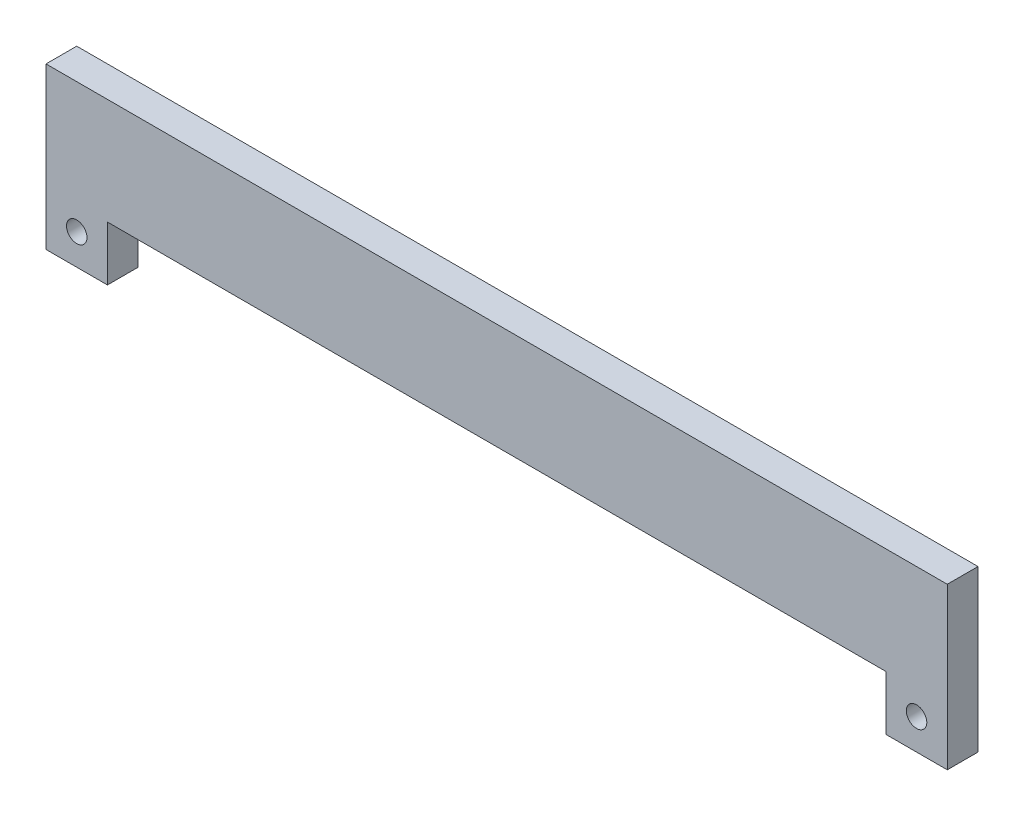
ISO-10303-21;
HEADER;
FILE_DESCRIPTION(('STEP AP214'),'2;1');
FILE_NAME('part.step','',(''),(''),'','','');
FILE_SCHEMA(('AUTOMOTIVE_DESIGN { 1 0 10303 214 1 1 1 1 }'));
ENDSEC;
DATA;
#1=APPLICATION_CONTEXT('core data for automotive mechanical design processes');
#2=APPLICATION_PROTOCOL_DEFINITION('international standard','automotive_design',2000,#1);
#3=PRODUCT_CONTEXT('',#1,'mechanical');
#4=PRODUCT('Part','Part','',(#3));
#5=PRODUCT_RELATED_PRODUCT_CATEGORY('part','',(#4));
#6=PRODUCT_DEFINITION_FORMATION('','',#4);
#7=PRODUCT_DEFINITION_CONTEXT('part definition',#1,'design');
#8=PRODUCT_DEFINITION('design','',#6,#7);
#9=PRODUCT_DEFINITION_SHAPE('','',#8);
#10=(LENGTH_UNIT() NAMED_UNIT(*) SI_UNIT(.MILLI.,.METRE.));
#11=(NAMED_UNIT(*) PLANE_ANGLE_UNIT() SI_UNIT($,.RADIAN.));
#12=(NAMED_UNIT(*) SI_UNIT($,.STERADIAN.) SOLID_ANGLE_UNIT());
#13=UNCERTAINTY_MEASURE_WITH_UNIT(LENGTH_MEASURE(1.E-05),#10,'distance_accuracy_value','');
#14=(GEOMETRIC_REPRESENTATION_CONTEXT(3) GLOBAL_UNCERTAINTY_ASSIGNED_CONTEXT((#13)) GLOBAL_UNIT_ASSIGNED_CONTEXT((#10,
#11,#12)) REPRESENTATION_CONTEXT('',''));
#15=CARTESIAN_POINT('',(0.,0.,0.));
#16=DIRECTION('',(0.,0.,1.));
#17=DIRECTION('',(1.,0.,0.));
#18=AXIS2_PLACEMENT_3D('',#15,#16,#17);
#19=CARTESIAN_POINT('',(-241.3,0.,19.05));
#20=DIRECTION('',(1.,0.,0.));
#21=DIRECTION('',(0.,0.,-1.));
#22=AXIS2_PLACEMENT_3D('',#19,#20,#21);
#23=PLANE('',#22);
#24=DIRECTION('',(0.,-1.,0.));
#25=VECTOR('',#24,1.);
#26=CARTESIAN_POINT('',(-241.3,0.,0.));
#27=LINE('',#26,#25);
#28=CARTESIAN_POINT('',(-241.3,-25.755,0.));
#29=VERTEX_POINT('',#28);
#30=CARTESIAN_POINT('',(-241.3,-59.55,0.));
#31=VERTEX_POINT('',#30);
#32=EDGE_CURVE('E136',#29,#31,#27,.T.);
#33=ORIENTED_EDGE('',*,*,#32,.F.);
#34=DIRECTION('',(0.,0.,-1.));
#35=VECTOR('',#34,1.);
#36=CARTESIAN_POINT('',(-241.3,-25.755,19.05));
#37=LINE('',#36,#35);
#38=CARTESIAN_POINT('',(-241.3,-25.755,19.05));
#39=VERTEX_POINT('',#38);
#40=EDGE_CURVE('E11',#39,#29,#37,.T.);
#41=ORIENTED_EDGE('',*,*,#40,.F.);
#42=DIRECTION('',(0.,-1.,0.));
#43=VECTOR('',#42,1.);
#44=CARTESIAN_POINT('',(-241.3,0.,19.05));
#45=LINE('',#44,#43);
#46=CARTESIAN_POINT('',(-241.3,-59.55,19.05));
#47=VERTEX_POINT('',#46);
#48=EDGE_CURVE('E158',#39,#47,#45,.T.);
#49=ORIENTED_EDGE('',*,*,#48,.T.);
#50=DIRECTION('',(0.,0.,-1.));
#51=VECTOR('',#50,1.);
#52=CARTESIAN_POINT('',(-241.3,-59.55,19.05));
#53=LINE('',#52,#51);
#54=EDGE_CURVE('E51',#47,#31,#53,.T.);
#55=ORIENTED_EDGE('',*,*,#54,.T.);
#56=EDGE_LOOP('',(#33,#41,#49,#55));
#57=FACE_BOUND('',#56,.T.);
#58=ADVANCED_FACE('F35',(#57),#23,.T.);
#59=CARTESIAN_POINT('',(0.,-25.755,19.05));
#60=DIRECTION('',(0.,1.,0.));
#61=DIRECTION('',(-1.,0.,0.));
#62=AXIS2_PLACEMENT_3D('',#59,#60,#61);
#63=PLANE('',#62);
#64=DIRECTION('',(1.,0.,0.));
#65=VECTOR('',#64,1.);
#66=CARTESIAN_POINT('',(0.,-25.755,0.));
#67=LINE('',#66,#65);
#68=CARTESIAN_POINT('',(241.3,-25.755,0.));
#69=VERTEX_POINT('',#68);
#70=EDGE_CURVE('E138',#29,#69,#67,.T.);
#71=ORIENTED_EDGE('',*,*,#70,.T.);
#72=DIRECTION('',(0.,0.,-1.));
#73=VECTOR('',#72,1.);
#74=CARTESIAN_POINT('',(241.3,-25.755,19.05));
#75=LINE('',#74,#73);
#76=CARTESIAN_POINT('',(241.3,-25.755,19.05));
#77=VERTEX_POINT('',#76);
#78=EDGE_CURVE('E43',#77,#69,#75,.T.);
#79=ORIENTED_EDGE('',*,*,#78,.F.);
#80=DIRECTION('',(1.,0.,0.));
#81=VECTOR('',#80,1.);
#82=CARTESIAN_POINT('',(0.,-25.755,19.05));
#83=LINE('',#82,#81);
#84=EDGE_CURVE('E192',#39,#77,#83,.T.);
#85=ORIENTED_EDGE('',*,*,#84,.F.);
#86=ORIENTED_EDGE('',*,*,#40,.T.);
#87=EDGE_LOOP('',(#71,#79,#85,#86));
#88=FACE_BOUND('',#87,.T.);
#89=ADVANCED_FACE('F209',(#88),#63,.F.);
#90=CARTESIAN_POINT('',(241.3,0.,19.05));
#91=DIRECTION('',(1.,0.,0.));
#92=DIRECTION('',(0.,0.,-1.));
#93=AXIS2_PLACEMENT_3D('',#90,#91,#92);
#94=PLANE('',#93);
#95=DIRECTION('',(0.,-1.,0.));
#96=VECTOR('',#95,1.);
#97=CARTESIAN_POINT('',(241.3,0.,0.));
#98=LINE('',#97,#96);
#99=CARTESIAN_POINT('',(241.3,-59.55,0.));
#100=VERTEX_POINT('',#99);
#101=EDGE_CURVE('E140',#69,#100,#98,.T.);
#102=ORIENTED_EDGE('',*,*,#101,.T.);
#103=DIRECTION('',(0.,0.,-1.));
#104=VECTOR('',#103,1.);
#105=CARTESIAN_POINT('',(241.3,-59.55,19.05));
#106=LINE('',#105,#104);
#107=CARTESIAN_POINT('',(241.3,-59.55,19.05));
#108=VERTEX_POINT('',#107);
#109=EDGE_CURVE('E165',#108,#100,#106,.T.);
#110=ORIENTED_EDGE('',*,*,#109,.F.);
#111=DIRECTION('',(0.,-1.,0.));
#112=VECTOR('',#111,1.);
#113=CARTESIAN_POINT('',(241.3,0.,19.05));
#114=LINE('',#113,#112);
#115=EDGE_CURVE('E174',#77,#108,#114,.T.);
#116=ORIENTED_EDGE('',*,*,#115,.F.);
#117=ORIENTED_EDGE('',*,*,#78,.T.);
#118=EDGE_LOOP('',(#102,#110,#116,#117));
#119=FACE_BOUND('',#118,.T.);
#120=ADVANCED_FACE('F172',(#119),#94,.F.);
#121=CARTESIAN_POINT('',(0.,-59.55,19.05));
#122=DIRECTION('',(0.,1.,0.));
#123=DIRECTION('',(0.,0.,1.));
#124=AXIS2_PLACEMENT_3D('',#121,#122,#123);
#125=PLANE('',#124);
#126=DIRECTION('',(1.,0.,0.));
#127=VECTOR('',#126,1.);
#128=CARTESIAN_POINT('',(0.,-59.55,0.));
#129=LINE('',#128,#127);
#130=CARTESIAN_POINT('',(279.4,-59.55,0.));
#131=VERTEX_POINT('',#130);
#132=EDGE_CURVE('E142',#100,#131,#129,.T.);
#133=ORIENTED_EDGE('',*,*,#132,.T.);
#134=DIRECTION('',(0.,0.,-1.));
#135=VECTOR('',#134,1.);
#136=CARTESIAN_POINT('',(279.4,-59.55,19.05));
#137=LINE('',#136,#135);
#138=CARTESIAN_POINT('',(279.4,-59.55,19.05));
#139=VERTEX_POINT('',#138);
#140=EDGE_CURVE('E162',#139,#131,#137,.T.);
#141=ORIENTED_EDGE('',*,*,#140,.F.);
#142=DIRECTION('',(1.,0.,0.));
#143=VECTOR('',#142,1.);
#144=CARTESIAN_POINT('',(0.,-59.55,19.05));
#145=LINE('',#144,#143);
#146=EDGE_CURVE('E188',#108,#139,#145,.T.);
#147=ORIENTED_EDGE('',*,*,#146,.F.);
#148=ORIENTED_EDGE('',*,*,#109,.T.);
#149=EDGE_LOOP('',(#133,#141,#147,#148));
#150=FACE_BOUND('',#149,.T.);
#151=ADVANCED_FACE('F184',(#150),#125,.F.);
#152=CARTESIAN_POINT('',(279.4,0.,19.05));
#153=DIRECTION('',(-1.,0.,0.));
#154=DIRECTION('',(0.,0.,1.));
#155=AXIS2_PLACEMENT_3D('',#152,#153,#154);
#156=PLANE('',#155);
#157=DIRECTION('',(0.,1.,0.));
#158=VECTOR('',#157,1.);
#159=CARTESIAN_POINT('',(279.4,0.,0.));
#160=LINE('',#159,#158);
#161=CARTESIAN_POINT('',(279.4,40.1000000000001,0.));
#162=VERTEX_POINT('',#161);
#163=EDGE_CURVE('E144',#131,#162,#160,.T.);
#164=ORIENTED_EDGE('',*,*,#163,.T.);
#165=DIRECTION('',(0.,0.,-1.));
#166=VECTOR('',#165,1.);
#167=CARTESIAN_POINT('',(279.4,40.1000000000001,19.05));
#168=LINE('',#167,#166);
#169=CARTESIAN_POINT('',(279.4,40.1000000000001,19.05));
#170=VERTEX_POINT('',#169);
#171=EDGE_CURVE('E122',#170,#162,#168,.T.);
#172=ORIENTED_EDGE('',*,*,#171,.F.);
#173=DIRECTION('',(0.,1.,0.));
#174=VECTOR('',#173,1.);
#175=CARTESIAN_POINT('',(279.4,0.,19.05));
#176=LINE('',#175,#174);
#177=EDGE_CURVE('E110',#139,#170,#176,.T.);
#178=ORIENTED_EDGE('',*,*,#177,.F.);
#179=ORIENTED_EDGE('',*,*,#140,.T.);
#180=EDGE_LOOP('',(#164,#172,#178,#179));
#181=FACE_BOUND('',#180,.T.);
#182=ADVANCED_FACE('F187',(#181),#156,.F.);
#183=CARTESIAN_POINT('',(0.,40.1,19.05));
#184=DIRECTION('',(0.,-1.,0.));
#185=DIRECTION('',(1.,0.,0.));
#186=AXIS2_PLACEMENT_3D('',#183,#184,#185);
#187=PLANE('',#186);
#188=DIRECTION('',(-1.,0.,0.));
#189=VECTOR('',#188,1.);
#190=CARTESIAN_POINT('',(0.,40.1,0.));
#191=LINE('',#190,#189);
#192=CARTESIAN_POINT('',(-279.4,40.1,0.));
#193=VERTEX_POINT('',#192);
#194=EDGE_CURVE('E119',#162,#193,#191,.T.);
#195=ORIENTED_EDGE('',*,*,#194,.T.);
#196=DIRECTION('',(0.,0.,-1.));
#197=VECTOR('',#196,1.);
#198=CARTESIAN_POINT('',(-279.4,40.1,19.05));
#199=LINE('',#198,#197);
#200=CARTESIAN_POINT('',(-279.4,40.1,19.05));
#201=VERTEX_POINT('',#200);
#202=EDGE_CURVE('E116',#201,#193,#199,.T.);
#203=ORIENTED_EDGE('',*,*,#202,.F.);
#204=DIRECTION('',(-1.,0.,0.));
#205=VECTOR('',#204,1.);
#206=CARTESIAN_POINT('',(0.,40.1,19.05));
#207=LINE('',#206,#205);
#208=EDGE_CURVE('E101',#170,#201,#207,.T.);
#209=ORIENTED_EDGE('',*,*,#208,.F.);
#210=ORIENTED_EDGE('',*,*,#171,.T.);
#211=EDGE_LOOP('',(#195,#203,#209,#210));
#212=FACE_BOUND('',#211,.T.);
#213=ADVANCED_FACE('F117',(#212),#187,.F.);
#214=CARTESIAN_POINT('',(-279.4,0.,19.05));
#215=DIRECTION('',(-1.,0.,0.));
#216=DIRECTION('',(0.,0.,1.));
#217=AXIS2_PLACEMENT_3D('',#214,#215,#216);
#218=PLANE('',#217);
#219=DIRECTION('',(0.,1.,0.));
#220=VECTOR('',#219,1.);
#221=CARTESIAN_POINT('',(-279.4,0.,0.));
#222=LINE('',#221,#220);
#223=CARTESIAN_POINT('',(-279.4,-59.55,0.));
#224=VERTEX_POINT('',#223);
#225=EDGE_CURVE('E147',#224,#193,#222,.T.);
#226=ORIENTED_EDGE('',*,*,#225,.F.);
#227=DIRECTION('',(0.,0.,-1.));
#228=VECTOR('',#227,1.);
#229=CARTESIAN_POINT('',(-279.4,-59.55,19.05));
#230=LINE('',#229,#228);
#231=CARTESIAN_POINT('',(-279.4,-59.55,19.05));
#232=VERTEX_POINT('',#231);
#233=EDGE_CURVE('E76',#232,#224,#230,.T.);
#234=ORIENTED_EDGE('',*,*,#233,.F.);
#235=DIRECTION('',(0.,1.,0.));
#236=VECTOR('',#235,1.);
#237=CARTESIAN_POINT('',(-279.4,0.,19.05));
#238=LINE('',#237,#236);
#239=EDGE_CURVE('E108',#232,#201,#238,.T.);
#240=ORIENTED_EDGE('',*,*,#239,.T.);
#241=ORIENTED_EDGE('',*,*,#202,.T.);
#242=EDGE_LOOP('',(#226,#234,#240,#241));
#243=FACE_BOUND('',#242,.T.);
#244=ADVANCED_FACE('F124',(#243),#218,.T.);
#245=CARTESIAN_POINT('',(260.35,-40.5,19.05));
#246=DIRECTION('',(0.,0.,-1.));
#247=DIRECTION('',(-1.,0.,0.));
#248=AXIS2_PLACEMENT_3D('',#245,#246,#247);
#249=CYLINDRICAL_SURFACE('',#248,6.35);
#250=CARTESIAN_POINT('',(260.35,-40.5,19.05));
#251=DIRECTION('',(0.,0.,1.));
#252=DIRECTION('',(1.,0.,0.));
#253=AXIS2_PLACEMENT_3D('',#250,#251,#252);
#254=CIRCLE('',#253,6.35);
#255=CARTESIAN_POINT('',(254.,-40.5,19.05));
#256=VERTEX_POINT('',#255);
#257=EDGE_CURVE('E127',#256,#256,#254,.T.);
#258=CARTESIAN_POINT('',(260.35,-40.5,0.));
#259=DIRECTION('',(0.,0.,1.));
#260=DIRECTION('',(1.,0.,0.));
#261=AXIS2_PLACEMENT_3D('',#258,#259,#260);
#262=CIRCLE('',#261,6.35);
#263=CARTESIAN_POINT('',(254.,-40.5,0.));
#264=VERTEX_POINT('',#263);
#265=EDGE_CURVE('E152',#264,#264,#262,.T.);
#266=CARTESIAN_POINT('',(254.,-40.5,19.05));
#267=CARTESIAN_POINT('',(254.,-40.5,18.8515625));
#268=CARTESIAN_POINT('',(254.,-40.5,18.653125));
#269=CARTESIAN_POINT('',(254.,-40.5,18.25625));
#270=CARTESIAN_POINT('',(254.,-40.5,18.0578125));
#271=CARTESIAN_POINT('',(254.,-40.5,17.6609375));
#272=CARTESIAN_POINT('',(254.,-40.5,17.4625));
#273=CARTESIAN_POINT('',(254.,-40.5,17.065625));
#274=CARTESIAN_POINT('',(254.,-40.5,16.8671875));
#275=CARTESIAN_POINT('',(254.,-40.5,16.4703125));
#276=CARTESIAN_POINT('',(254.,-40.5,16.271875));
#277=CARTESIAN_POINT('',(254.,-40.5,15.875));
#278=CARTESIAN_POINT('',(254.,-40.5,15.6765625));
#279=CARTESIAN_POINT('',(254.,-40.5,15.2796875));
#280=CARTESIAN_POINT('',(254.,-40.5,15.08125));
#281=CARTESIAN_POINT('',(254.,-40.5,14.684375));
#282=CARTESIAN_POINT('',(254.,-40.5,14.4859375));
#283=CARTESIAN_POINT('',(254.,-40.5,14.0890625));
#284=CARTESIAN_POINT('',(254.,-40.5,13.890625));
#285=CARTESIAN_POINT('',(254.,-40.5,13.49375));
#286=CARTESIAN_POINT('',(254.,-40.5,13.2953125));
#287=CARTESIAN_POINT('',(254.,-40.5,12.8984375));
#288=CARTESIAN_POINT('',(254.,-40.5,12.7));
#289=CARTESIAN_POINT('',(254.,-40.5,12.303125));
#290=CARTESIAN_POINT('',(254.,-40.5,12.1046875));
#291=CARTESIAN_POINT('',(254.,-40.5,11.7078125));
#292=CARTESIAN_POINT('',(254.,-40.5,11.509375));
#293=CARTESIAN_POINT('',(254.,-40.5,11.1125));
#294=CARTESIAN_POINT('',(254.,-40.5,10.9140625));
#295=CARTESIAN_POINT('',(254.,-40.5,10.5171875));
#296=CARTESIAN_POINT('',(254.,-40.5,10.31875));
#297=CARTESIAN_POINT('',(254.,-40.5,9.921875));
#298=CARTESIAN_POINT('',(254.,-40.5,9.7234375));
#299=CARTESIAN_POINT('',(254.,-40.5,9.3265625));
#300=CARTESIAN_POINT('',(254.,-40.5,9.128125));
#301=CARTESIAN_POINT('',(254.,-40.5,8.73125));
#302=CARTESIAN_POINT('',(254.,-40.5,8.5328125));
#303=CARTESIAN_POINT('',(254.,-40.5,8.1359375));
#304=CARTESIAN_POINT('',(254.,-40.5,7.9375));
#305=CARTESIAN_POINT('',(254.,-40.5,7.540625));
#306=CARTESIAN_POINT('',(254.,-40.5,7.3421875));
#307=CARTESIAN_POINT('',(254.,-40.5,6.9453125));
#308=CARTESIAN_POINT('',(254.,-40.5,6.746875));
#309=CARTESIAN_POINT('',(254.,-40.5,6.35));
#310=CARTESIAN_POINT('',(254.,-40.5,6.1515625));
#311=CARTESIAN_POINT('',(254.,-40.5,5.7546875));
#312=CARTESIAN_POINT('',(254.,-40.5,5.55625));
#313=CARTESIAN_POINT('',(254.,-40.5,5.159375));
#314=CARTESIAN_POINT('',(254.,-40.5,4.9609375));
#315=CARTESIAN_POINT('',(254.,-40.5,4.5640625));
#316=CARTESIAN_POINT('',(254.,-40.5,4.365625));
#317=CARTESIAN_POINT('',(254.,-40.5,3.96875));
#318=CARTESIAN_POINT('',(254.,-40.5,3.7703125));
#319=CARTESIAN_POINT('',(254.,-40.5,3.3734375));
#320=CARTESIAN_POINT('',(254.,-40.5,3.175));
#321=CARTESIAN_POINT('',(254.,-40.5,2.778125));
#322=CARTESIAN_POINT('',(254.,-40.5,2.5796875));
#323=CARTESIAN_POINT('',(254.,-40.5,2.1828125));
#324=CARTESIAN_POINT('',(254.,-40.5,1.984375));
#325=CARTESIAN_POINT('',(254.,-40.5,1.5875));
#326=CARTESIAN_POINT('',(254.,-40.5,1.3890625));
#327=CARTESIAN_POINT('',(254.,-40.5,0.992187500000001));
#328=CARTESIAN_POINT('',(254.,-40.5,0.793750000000001));
#329=CARTESIAN_POINT('',(254.,-40.5,0.396875));
#330=CARTESIAN_POINT('',(254.,-40.5,0.1984375));
#331=CARTESIAN_POINT('',(254.,-40.5,0.));
#332=B_SPLINE_CURVE_WITH_KNOTS('',3,(#266,#267,#268,#269,#270,#271,#272,#273,#274,#275,#276,
#277,#278,#279,#280,#281,#282,#283,#284,#285,#286,#287,#288,#289,#290,#291,#292,#293,#294,#295,
#296,#297,#298,#299,#300,#301,#302,#303,#304,#305,#306,#307,#308,#309,#310,#311,#312,#313,#314,
#315,#316,#317,#318,#319,#320,#321,#322,#323,#324,#325,#326,#327,#328,#329,#330,#331),
.UNSPECIFIED.,.F.,.F.,(4,2,2,2,2,2,2,2,2,2,2,2,2,2,2,2,2,2,2,2,2,2,2,2,2,2,2,2,2,2,2,2,4),(0.,
0.5953125,1.190625,1.7859375,2.38125,2.9765625,3.571875,4.1671875,4.7625,5.3578125,5.953125,
6.5484375,7.14375,7.7390625,8.334375,8.9296875,9.525,10.1203125,10.715625,11.3109375,11.90625,
12.5015625,13.096875,13.6921875,14.2875,14.8828125,15.478125,16.0734375,16.66875,17.2640625,
17.859375,18.4546875,19.05),.UNSPECIFIED.);
#333=EDGE_CURVE('BSEAM197',#256,#264,#332,.T.);
#334=ORIENTED_EDGE('',*,*,#257,.T.);
#335=ORIENTED_EDGE('',*,*,#265,.F.);
#336=ORIENTED_EDGE('',*,*,#333,.T.);
#337=ORIENTED_EDGE('',*,*,#333,.F.);
#338=EDGE_LOOP('',(#334,#336,#335,#337));
#339=FACE_BOUND('',#338,.T.);
#340=ADVANCED_FACE('F197',(#339),#249,.F.);
#341=CARTESIAN_POINT('',(0.,-59.55,19.05));
#342=DIRECTION('',(0.,-1.,0.));
#343=DIRECTION('',(1.,0.,0.));
#344=AXIS2_PLACEMENT_3D('',#341,#342,#343);
#345=PLANE('',#344);
#346=DIRECTION('',(-1.,0.,0.));
#347=VECTOR('',#346,1.);
#348=CARTESIAN_POINT('',(0.,-59.55,0.));
#349=LINE('',#348,#347);
#350=EDGE_CURVE('E149',#31,#224,#349,.T.);
#351=ORIENTED_EDGE('',*,*,#350,.F.);
#352=ORIENTED_EDGE('',*,*,#54,.F.);
#353=DIRECTION('',(-1.,0.,0.));
#354=VECTOR('',#353,1.);
#355=CARTESIAN_POINT('',(0.,-59.55,19.05));
#356=LINE('',#355,#354);
#357=EDGE_CURVE('E125',#47,#232,#356,.T.);
#358=ORIENTED_EDGE('',*,*,#357,.T.);
#359=ORIENTED_EDGE('',*,*,#233,.T.);
#360=EDGE_LOOP('',(#351,#352,#358,#359));
#361=FACE_BOUND('',#360,.T.);
#362=ADVANCED_FACE('F194',(#361),#345,.T.);
#363=CARTESIAN_POINT('',(-260.35,-40.5,19.05));
#364=DIRECTION('',(0.,0.,-1.));
#365=DIRECTION('',(-1.,0.,0.));
#366=AXIS2_PLACEMENT_3D('',#363,#364,#365);
#367=CYLINDRICAL_SURFACE('',#366,6.35);
#368=CARTESIAN_POINT('',(-260.35,-40.5,19.05));
#369=DIRECTION('',(0.,0.,1.));
#370=DIRECTION('',(1.,0.,0.));
#371=AXIS2_PLACEMENT_3D('',#368,#369,#370);
#372=CIRCLE('',#371,6.35);
#373=CARTESIAN_POINT('',(-266.7,-40.5,19.05));
#374=VERTEX_POINT('',#373);
#375=EDGE_CURVE('E133',#374,#374,#372,.F.);
#376=CARTESIAN_POINT('',(-260.35,-40.5,0.));
#377=DIRECTION('',(0.,0.,1.));
#378=DIRECTION('',(1.,0.,0.));
#379=AXIS2_PLACEMENT_3D('',#376,#377,#378);
#380=CIRCLE('',#379,6.35);
#381=CARTESIAN_POINT('',(-266.7,-40.5,0.));
#382=VERTEX_POINT('',#381);
#383=EDGE_CURVE('E155',#382,#382,#380,.F.);
#384=CARTESIAN_POINT('',(-266.7,-40.5,19.05));
#385=CARTESIAN_POINT('',(-266.7,-40.5,18.8515625));
#386=CARTESIAN_POINT('',(-266.7,-40.5,18.653125));
#387=CARTESIAN_POINT('',(-266.7,-40.5,18.25625));
#388=CARTESIAN_POINT('',(-266.7,-40.5,18.0578125));
#389=CARTESIAN_POINT('',(-266.7,-40.5,17.6609375));
#390=CARTESIAN_POINT('',(-266.7,-40.5,17.4625));
#391=CARTESIAN_POINT('',(-266.7,-40.5,17.065625));
#392=CARTESIAN_POINT('',(-266.7,-40.5,16.8671875));
#393=CARTESIAN_POINT('',(-266.7,-40.5,16.4703125));
#394=CARTESIAN_POINT('',(-266.7,-40.5,16.271875));
#395=CARTESIAN_POINT('',(-266.7,-40.5,15.875));
#396=CARTESIAN_POINT('',(-266.7,-40.5,15.6765625));
#397=CARTESIAN_POINT('',(-266.7,-40.5,15.2796875));
#398=CARTESIAN_POINT('',(-266.7,-40.5,15.08125));
#399=CARTESIAN_POINT('',(-266.7,-40.5,14.684375));
#400=CARTESIAN_POINT('',(-266.7,-40.5,14.4859375));
#401=CARTESIAN_POINT('',(-266.7,-40.5,14.0890625));
#402=CARTESIAN_POINT('',(-266.7,-40.5,13.890625));
#403=CARTESIAN_POINT('',(-266.7,-40.5,13.49375));
#404=CARTESIAN_POINT('',(-266.7,-40.5,13.2953125));
#405=CARTESIAN_POINT('',(-266.7,-40.5,12.8984375));
#406=CARTESIAN_POINT('',(-266.7,-40.5,12.7));
#407=CARTESIAN_POINT('',(-266.7,-40.5,12.303125));
#408=CARTESIAN_POINT('',(-266.7,-40.5,12.1046875));
#409=CARTESIAN_POINT('',(-266.7,-40.5,11.7078125));
#410=CARTESIAN_POINT('',(-266.7,-40.5,11.509375));
#411=CARTESIAN_POINT('',(-266.7,-40.5,11.1125));
#412=CARTESIAN_POINT('',(-266.7,-40.5,10.9140625));
#413=CARTESIAN_POINT('',(-266.7,-40.5,10.5171875));
#414=CARTESIAN_POINT('',(-266.7,-40.5,10.31875));
#415=CARTESIAN_POINT('',(-266.7,-40.5,9.921875));
#416=CARTESIAN_POINT('',(-266.7,-40.5,9.7234375));
#417=CARTESIAN_POINT('',(-266.7,-40.5,9.3265625));
#418=CARTESIAN_POINT('',(-266.7,-40.5,9.128125));
#419=CARTESIAN_POINT('',(-266.7,-40.5,8.73125));
#420=CARTESIAN_POINT('',(-266.7,-40.5,8.5328125));
#421=CARTESIAN_POINT('',(-266.7,-40.5,8.1359375));
#422=CARTESIAN_POINT('',(-266.7,-40.5,7.9375));
#423=CARTESIAN_POINT('',(-266.7,-40.5,7.540625));
#424=CARTESIAN_POINT('',(-266.7,-40.5,7.3421875));
#425=CARTESIAN_POINT('',(-266.7,-40.5,6.9453125));
#426=CARTESIAN_POINT('',(-266.7,-40.5,6.746875));
#427=CARTESIAN_POINT('',(-266.7,-40.5,6.35));
#428=CARTESIAN_POINT('',(-266.7,-40.5,6.1515625));
#429=CARTESIAN_POINT('',(-266.7,-40.5,5.7546875));
#430=CARTESIAN_POINT('',(-266.7,-40.5,5.55625));
#431=CARTESIAN_POINT('',(-266.7,-40.5,5.159375));
#432=CARTESIAN_POINT('',(-266.7,-40.5,4.9609375));
#433=CARTESIAN_POINT('',(-266.7,-40.5,4.5640625));
#434=CARTESIAN_POINT('',(-266.7,-40.5,4.365625));
#435=CARTESIAN_POINT('',(-266.7,-40.5,3.96875));
#436=CARTESIAN_POINT('',(-266.7,-40.5,3.7703125));
#437=CARTESIAN_POINT('',(-266.7,-40.5,3.3734375));
#438=CARTESIAN_POINT('',(-266.7,-40.5,3.175));
#439=CARTESIAN_POINT('',(-266.7,-40.5,2.778125));
#440=CARTESIAN_POINT('',(-266.7,-40.5,2.5796875));
#441=CARTESIAN_POINT('',(-266.7,-40.5,2.1828125));
#442=CARTESIAN_POINT('',(-266.7,-40.5,1.984375));
#443=CARTESIAN_POINT('',(-266.7,-40.5,1.5875));
#444=CARTESIAN_POINT('',(-266.7,-40.5,1.3890625));
#445=CARTESIAN_POINT('',(-266.7,-40.5,0.992187500000001));
#446=CARTESIAN_POINT('',(-266.7,-40.5,0.793750000000001));
#447=CARTESIAN_POINT('',(-266.7,-40.5,0.396875));
#448=CARTESIAN_POINT('',(-266.7,-40.5,0.1984375));
#449=CARTESIAN_POINT('',(-266.7,-40.5,0.));
#450=B_SPLINE_CURVE_WITH_KNOTS('',3,(#384,#385,#386,#387,#388,#389,#390,#391,#392,#393,#394,
#395,#396,#397,#398,#399,#400,#401,#402,#403,#404,#405,#406,#407,#408,#409,#410,#411,#412,#413,
#414,#415,#416,#417,#418,#419,#420,#421,#422,#423,#424,#425,#426,#427,#428,#429,#430,#431,#432,
#433,#434,#435,#436,#437,#438,#439,#440,#441,#442,#443,#444,#445,#446,#447,#448,#449),
.UNSPECIFIED.,.F.,.F.,(4,2,2,2,2,2,2,2,2,2,2,2,2,2,2,2,2,2,2,2,2,2,2,2,2,2,2,2,2,2,2,2,4),(0.,
0.5953125,1.190625,1.7859375,2.38125,2.9765625,3.571875,4.1671875,4.7625,5.3578125,5.953125,
6.5484375,7.14375,7.7390625,8.334375,8.9296875,9.525,10.1203125,10.715625,11.3109375,11.90625,
12.5015625,13.096875,13.6921875,14.2875,14.8828125,15.478125,16.0734375,16.66875,17.2640625,
17.859375,18.4546875,19.05),.UNSPECIFIED.);
#451=EDGE_CURVE('BSEAM196',#374,#382,#450,.T.);
#452=ORIENTED_EDGE('',*,*,#375,.F.);
#453=ORIENTED_EDGE('',*,*,#383,.T.);
#454=ORIENTED_EDGE('',*,*,#451,.T.);
#455=ORIENTED_EDGE('',*,*,#451,.F.);
#456=EDGE_LOOP('',(#452,#454,#453,#455));
#457=FACE_BOUND('',#456,.T.);
#458=ADVANCED_FACE('F196',(#457),#367,.F.);
#459=CARTESIAN_POINT('',(0.,0.,19.05));
#460=DIRECTION('',(0.,0.,1.));
#461=DIRECTION('',(1.,0.,0.));
#462=AXIS2_PLACEMENT_3D('',#459,#460,#461);
#463=PLANE('',#462);
#464=ORIENTED_EDGE('',*,*,#48,.F.);
#465=ORIENTED_EDGE('',*,*,#84,.T.);
#466=ORIENTED_EDGE('',*,*,#115,.T.);
#467=ORIENTED_EDGE('',*,*,#146,.T.);
#468=ORIENTED_EDGE('',*,*,#177,.T.);
#469=ORIENTED_EDGE('',*,*,#208,.T.);
#470=ORIENTED_EDGE('',*,*,#239,.F.);
#471=ORIENTED_EDGE('',*,*,#357,.F.);
#472=EDGE_LOOP('',(#464,#465,#466,#467,#468,#469,#470,#471));
#473=FACE_BOUND('',#472,.T.);
#474=ORIENTED_EDGE('',*,*,#257,.F.);
#475=EDGE_LOOP('',(#474));
#476=FACE_BOUND('',#475,.T.);
#477=ORIENTED_EDGE('',*,*,#375,.T.);
#478=EDGE_LOOP('',(#477));
#479=FACE_BOUND('',#478,.T.);
#480=ADVANCED_FACE('F104',(#473,#476,#479),#463,.T.);
#481=CARTESIAN_POINT('',(0.,0.,0.));
#482=DIRECTION('',(0.,0.,1.));
#483=DIRECTION('',(1.,0.,0.));
#484=AXIS2_PLACEMENT_3D('',#481,#482,#483);
#485=PLANE('',#484);
#486=ORIENTED_EDGE('',*,*,#32,.T.);
#487=ORIENTED_EDGE('',*,*,#350,.T.);
#488=ORIENTED_EDGE('',*,*,#225,.T.);
#489=ORIENTED_EDGE('',*,*,#194,.F.);
#490=ORIENTED_EDGE('',*,*,#163,.F.);
#491=ORIENTED_EDGE('',*,*,#132,.F.);
#492=ORIENTED_EDGE('',*,*,#101,.F.);
#493=ORIENTED_EDGE('',*,*,#70,.F.);
#494=EDGE_LOOP('',(#486,#487,#488,#489,#490,#491,#492,#493));
#495=FACE_BOUND('',#494,.T.);
#496=ORIENTED_EDGE('',*,*,#265,.T.);
#497=EDGE_LOOP('',(#496));
#498=FACE_BOUND('',#497,.T.);
#499=ORIENTED_EDGE('',*,*,#383,.F.);
#500=EDGE_LOOP('',(#499));
#501=FACE_BOUND('',#500,.T.);
#502=ADVANCED_FACE('F179',(#495,#498,#501),#485,.F.);
#503=CLOSED_SHELL('',(#58,#89,#120,#151,#182,#213,#244,#340,#362,#458,#480,#502));
#504=MANIFOLD_SOLID_BREP('B2',#503);
#505=ADVANCED_BREP_SHAPE_REPRESENTATION('',(#18,#504),#14);
#506=SHAPE_DEFINITION_REPRESENTATION(#9,#505);
ENDSEC;
END-ISO-10303-21;
